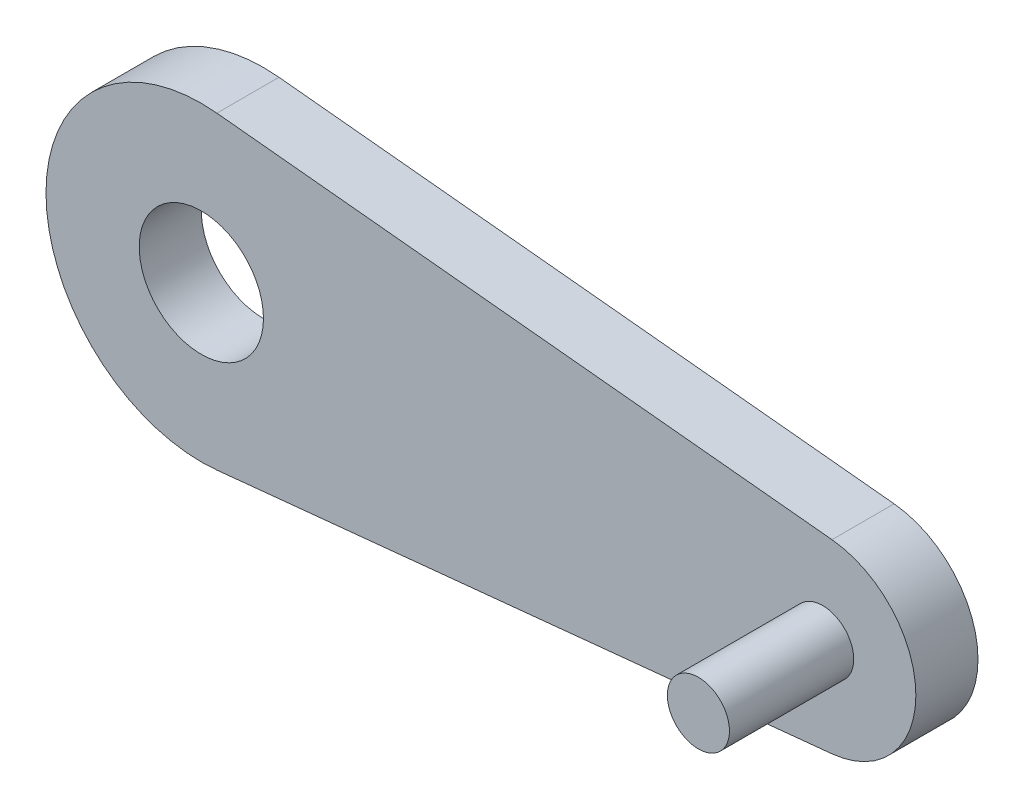
ISO-10303-21;
HEADER;
FILE_DESCRIPTION(('STEP AP214'),'2;1');
FILE_NAME('part.step','',(''),(''),'','','');
FILE_SCHEMA(('AUTOMOTIVE_DESIGN { 1 0 10303 214 1 1 1 1 }'));
ENDSEC;
DATA;
#1=APPLICATION_CONTEXT('core data for automotive mechanical design processes');
#2=APPLICATION_PROTOCOL_DEFINITION('international standard','automotive_design',2000,#1);
#3=PRODUCT_CONTEXT('',#1,'mechanical');
#4=PRODUCT('Part','Part','',(#3));
#5=PRODUCT_RELATED_PRODUCT_CATEGORY('part','',(#4));
#6=PRODUCT_DEFINITION_FORMATION('','',#4);
#7=PRODUCT_DEFINITION_CONTEXT('part definition',#1,'design');
#8=PRODUCT_DEFINITION('design','',#6,#7);
#9=PRODUCT_DEFINITION_SHAPE('','',#8);
#10=(LENGTH_UNIT() NAMED_UNIT(*) SI_UNIT(.MILLI.,.METRE.));
#11=(NAMED_UNIT(*) PLANE_ANGLE_UNIT() SI_UNIT($,.RADIAN.));
#12=(NAMED_UNIT(*) SI_UNIT($,.STERADIAN.) SOLID_ANGLE_UNIT());
#13=UNCERTAINTY_MEASURE_WITH_UNIT(LENGTH_MEASURE(1.E-05),#10,'distance_accuracy_value','');
#14=(GEOMETRIC_REPRESENTATION_CONTEXT(3) GLOBAL_UNCERTAINTY_ASSIGNED_CONTEXT((#13)) GLOBAL_UNIT_ASSIGNED_CONTEXT((#10,
#11,#12)) REPRESENTATION_CONTEXT('',''));
#15=CARTESIAN_POINT('',(0.,0.,0.));
#16=DIRECTION('',(0.,0.,1.));
#17=DIRECTION('',(1.,0.,0.));
#18=AXIS2_PLACEMENT_3D('',#15,#16,#17);
#19=CARTESIAN_POINT('',(0.,0.,1.));
#20=DIRECTION('',(0.,0.,1.));
#21=DIRECTION('',(1.,0.,0.));
#22=AXIS2_PLACEMENT_3D('',#19,#20,#21);
#23=PLANE('',#22);
#24=CARTESIAN_POINT('',(10.,0.,1.));
#25=DIRECTION('',(0.,0.,1.));
#26=DIRECTION('',(1.,0.,0.));
#27=AXIS2_PLACEMENT_3D('',#24,#25,#26);
#28=CIRCLE('',#27,0.500000000000001);
#29=CARTESIAN_POINT('',(10.5,0.,1.));
#30=VERTEX_POINT('',#29);
#31=EDGE_CURVE('E117',#30,#30,#28,.T.);
#32=ORIENTED_EDGE('',*,*,#31,.F.);
#33=EDGE_LOOP('',(#32));
#34=FACE_BOUND('',#33,.T.);
#35=CARTESIAN_POINT('',(0.,0.,1.));
#36=DIRECTION('',(0.,0.,1.));
#37=DIRECTION('',(1.,0.,0.));
#38=AXIS2_PLACEMENT_3D('',#35,#36,#37);
#39=CIRCLE('',#38,2.5);
#40=CARTESIAN_POINT('',(0.25,2.48746859276655,1.));
#41=VERTEX_POINT('',#40);
#42=CARTESIAN_POINT('',(0.25,-2.48746859276655,1.));
#43=VERTEX_POINT('',#42);
#44=EDGE_CURVE('E84',#41,#43,#39,.T.);
#45=ORIENTED_EDGE('',*,*,#44,.T.);
#46=DIRECTION('',(0.99498743710662,0.1,0.));
#47=VECTOR('',#46,1.);
#48=CARTESIAN_POINT('',(0.25,-2.48746859276655,1.));
#49=LINE('',#48,#47);
#50=CARTESIAN_POINT('',(10.15,-1.49248115565993,1.));
#51=VERTEX_POINT('',#50);
#52=EDGE_CURVE('E79',#43,#51,#49,.T.);
#53=ORIENTED_EDGE('',*,*,#52,.T.);
#54=CARTESIAN_POINT('',(10.,0.,1.));
#55=DIRECTION('',(0.,0.,1.));
#56=DIRECTION('',(1.,0.,0.));
#57=AXIS2_PLACEMENT_3D('',#54,#55,#56);
#58=CIRCLE('',#57,1.5);
#59=CARTESIAN_POINT('',(10.15,1.49248115565993,1.));
#60=VERTEX_POINT('',#59);
#61=EDGE_CURVE('E82',#51,#60,#58,.T.);
#62=ORIENTED_EDGE('',*,*,#61,.T.);
#63=DIRECTION('',(-0.99498743710662,0.1,0.));
#64=VECTOR('',#63,1.);
#65=CARTESIAN_POINT('',(0.25,2.48746859276655,1.));
#66=LINE('',#65,#64);
#67=EDGE_CURVE('E49',#60,#41,#66,.T.);
#68=ORIENTED_EDGE('',*,*,#67,.T.);
#69=EDGE_LOOP('',(#45,#53,#62,#68));
#70=FACE_BOUND('',#69,.T.);
#71=CARTESIAN_POINT('',(0.,0.,1.));
#72=DIRECTION('',(0.,0.,1.));
#73=DIRECTION('',(1.,0.,0.));
#74=AXIS2_PLACEMENT_3D('',#71,#72,#73);
#75=CIRCLE('',#74,1.);
#76=CARTESIAN_POINT('',(1.,0.,1.));
#77=VERTEX_POINT('',#76);
#78=EDGE_CURVE('E99',#77,#77,#75,.T.);
#79=ORIENTED_EDGE('',*,*,#78,.F.);
#80=EDGE_LOOP('',(#79));
#81=FACE_BOUND('',#80,.T.);
#82=ADVANCED_FACE('F32',(#34,#70,#81),#23,.T.);
#83=CARTESIAN_POINT('',(0.,0.,0.));
#84=DIRECTION('',(0.,0.,1.));
#85=DIRECTION('',(1.,0.,0.));
#86=AXIS2_PLACEMENT_3D('',#83,#84,#85);
#87=PLANE('',#86);
#88=CARTESIAN_POINT('',(0.,0.,0.));
#89=DIRECTION('',(0.,0.,1.));
#90=DIRECTION('',(1.,0.,0.));
#91=AXIS2_PLACEMENT_3D('',#88,#89,#90);
#92=CIRCLE('',#91,2.5);
#93=CARTESIAN_POINT('',(0.25,2.48746859276655,0.));
#94=VERTEX_POINT('',#93);
#95=CARTESIAN_POINT('',(0.25,-2.48746859276655,0.));
#96=VERTEX_POINT('',#95);
#97=EDGE_CURVE('E96',#94,#96,#92,.T.);
#98=ORIENTED_EDGE('',*,*,#97,.F.);
#99=DIRECTION('',(-0.99498743710662,0.1,0.));
#100=VECTOR('',#99,1.);
#101=CARTESIAN_POINT('',(0.25,2.48746859276655,0.));
#102=LINE('',#101,#100);
#103=CARTESIAN_POINT('',(10.15,1.49248115565993,0.));
#104=VERTEX_POINT('',#103);
#105=EDGE_CURVE('E72',#104,#94,#102,.T.);
#106=ORIENTED_EDGE('',*,*,#105,.F.);
#107=CARTESIAN_POINT('',(10.,0.,0.));
#108=DIRECTION('',(0.,0.,1.));
#109=DIRECTION('',(1.,0.,0.));
#110=AXIS2_PLACEMENT_3D('',#107,#108,#109);
#111=CIRCLE('',#110,1.5);
#112=CARTESIAN_POINT('',(10.15,-1.49248115565993,0.));
#113=VERTEX_POINT('',#112);
#114=EDGE_CURVE('E66',#113,#104,#111,.T.);
#115=ORIENTED_EDGE('',*,*,#114,.F.);
#116=DIRECTION('',(0.99498743710662,0.1,0.));
#117=VECTOR('',#116,1.);
#118=CARTESIAN_POINT('',(0.25,-2.48746859276655,0.));
#119=LINE('',#118,#117);
#120=EDGE_CURVE('E88',#96,#113,#119,.T.);
#121=ORIENTED_EDGE('',*,*,#120,.F.);
#122=EDGE_LOOP('',(#98,#106,#115,#121));
#123=FACE_BOUND('',#122,.T.);
#124=CARTESIAN_POINT('',(0.,0.,0.));
#125=DIRECTION('',(0.,0.,1.));
#126=DIRECTION('',(1.,0.,0.));
#127=AXIS2_PLACEMENT_3D('',#124,#125,#126);
#128=CIRCLE('',#127,1.);
#129=CARTESIAN_POINT('',(1.,0.,0.));
#130=VERTEX_POINT('',#129);
#131=EDGE_CURVE('E111',#130,#130,#128,.T.);
#132=ORIENTED_EDGE('',*,*,#131,.T.);
#133=EDGE_LOOP('',(#132));
#134=FACE_BOUND('',#133,.T.);
#135=ADVANCED_FACE('F107',(#123,#134),#87,.F.);
#136=CARTESIAN_POINT('',(0.,0.,1.));
#137=DIRECTION('',(0.,0.,-1.));
#138=DIRECTION('',(-1.,0.,0.));
#139=AXIS2_PLACEMENT_3D('',#136,#137,#138);
#140=CYLINDRICAL_SURFACE('',#139,2.5);
#141=ORIENTED_EDGE('',*,*,#97,.T.);
#142=DIRECTION('',(0.,0.,-1.));
#143=VECTOR('',#142,1.);
#144=CARTESIAN_POINT('',(0.25,-2.48746859276655,1.));
#145=LINE('',#144,#143);
#146=EDGE_CURVE('E11',#43,#96,#145,.T.);
#147=ORIENTED_EDGE('',*,*,#146,.F.);
#148=ORIENTED_EDGE('',*,*,#44,.F.);
#149=DIRECTION('',(0.,0.,-1.));
#150=VECTOR('',#149,1.);
#151=CARTESIAN_POINT('',(0.25,2.48746859276655,1.));
#152=LINE('',#151,#150);
#153=EDGE_CURVE('E92',#41,#94,#152,.T.);
#154=ORIENTED_EDGE('',*,*,#153,.T.);
#155=EDGE_LOOP('',(#141,#147,#148,#154));
#156=FACE_BOUND('',#155,.T.);
#157=ADVANCED_FACE('F34',(#156),#140,.T.);
#158=CARTESIAN_POINT('',(0.25,-2.48746859276655,1.));
#159=DIRECTION('',(-0.1,0.99498743710662,0.));
#160=DIRECTION('',(-0.99498743710662,-0.1,0.));
#161=AXIS2_PLACEMENT_3D('',#158,#159,#160);
#162=PLANE('',#161);
#163=ORIENTED_EDGE('',*,*,#120,.T.);
#164=DIRECTION('',(0.,0.,-1.));
#165=VECTOR('',#164,1.);
#166=CARTESIAN_POINT('',(10.15,-1.49248115565993,1.));
#167=LINE('',#166,#165);
#168=EDGE_CURVE('E41',#51,#113,#167,.T.);
#169=ORIENTED_EDGE('',*,*,#168,.F.);
#170=ORIENTED_EDGE('',*,*,#52,.F.);
#171=ORIENTED_EDGE('',*,*,#146,.T.);
#172=EDGE_LOOP('',(#163,#169,#170,#171));
#173=FACE_BOUND('',#172,.T.);
#174=ADVANCED_FACE('F87',(#173),#162,.F.);
#175=CARTESIAN_POINT('',(10.,0.,1.));
#176=DIRECTION('',(0.,0.,-1.));
#177=DIRECTION('',(-1.,0.,0.));
#178=AXIS2_PLACEMENT_3D('',#175,#176,#177);
#179=CYLINDRICAL_SURFACE('',#178,1.5);
#180=ORIENTED_EDGE('',*,*,#114,.T.);
#181=DIRECTION('',(0.,0.,-1.));
#182=VECTOR('',#181,1.);
#183=CARTESIAN_POINT('',(10.15,1.49248115565993,1.));
#184=LINE('',#183,#182);
#185=EDGE_CURVE('E89',#60,#104,#184,.T.);
#186=ORIENTED_EDGE('',*,*,#185,.F.);
#187=ORIENTED_EDGE('',*,*,#61,.F.);
#188=ORIENTED_EDGE('',*,*,#168,.T.);
#189=EDGE_LOOP('',(#180,#186,#187,#188));
#190=FACE_BOUND('',#189,.T.);
#191=ADVANCED_FACE('F90',(#190),#179,.T.);
#192=CARTESIAN_POINT('',(0.25,2.48746859276655,1.));
#193=DIRECTION('',(-0.1,-0.99498743710662,0.));
#194=DIRECTION('',(0.99498743710662,-0.1,0.));
#195=AXIS2_PLACEMENT_3D('',#192,#193,#194);
#196=PLANE('',#195);
#197=ORIENTED_EDGE('',*,*,#105,.T.);
#198=ORIENTED_EDGE('',*,*,#153,.F.);
#199=ORIENTED_EDGE('',*,*,#67,.F.);
#200=ORIENTED_EDGE('',*,*,#185,.T.);
#201=EDGE_LOOP('',(#197,#198,#199,#200));
#202=FACE_BOUND('',#201,.T.);
#203=ADVANCED_FACE('F104',(#202),#196,.F.);
#204=CARTESIAN_POINT('',(0.,0.,1.));
#205=DIRECTION('',(0.,0.,-1.));
#206=DIRECTION('',(-1.,0.,0.));
#207=AXIS2_PLACEMENT_3D('',#204,#205,#206);
#208=CYLINDRICAL_SURFACE('',#207,1.);
#209=ORIENTED_EDGE('',*,*,#78,.T.);
#210=EDGE_LOOP('',(#209));
#211=FACE_BOUND('',#210,.T.);
#212=ORIENTED_EDGE('',*,*,#131,.F.);
#213=EDGE_LOOP('',(#212));
#214=FACE_BOUND('',#213,.T.);
#215=ADVANCED_FACE('F128',(#211,#214),#208,.F.);
#216=CARTESIAN_POINT('',(10.,0.,3.));
#217=DIRECTION('',(0.,0.,-1.));
#218=DIRECTION('',(-1.,0.,0.));
#219=AXIS2_PLACEMENT_3D('',#216,#217,#218);
#220=CYLINDRICAL_SURFACE('',#219,0.500000000000001);
#221=CARTESIAN_POINT('',(10.,0.,3.));
#222=DIRECTION('',(0.,0.,1.));
#223=DIRECTION('',(1.,0.,0.));
#224=AXIS2_PLACEMENT_3D('',#221,#222,#223);
#225=CIRCLE('',#224,0.500000000000001);
#226=CARTESIAN_POINT('',(10.5,0.,3.));
#227=VERTEX_POINT('',#226);
#228=EDGE_CURVE('E114',#227,#227,#225,.T.);
#229=ORIENTED_EDGE('',*,*,#228,.F.);
#230=EDGE_LOOP('',(#229));
#231=FACE_BOUND('',#230,.T.);
#232=ORIENTED_EDGE('',*,*,#31,.T.);
#233=EDGE_LOOP('',(#232));
#234=FACE_BOUND('',#233,.T.);
#235=ADVANCED_FACE('F125',(#231,#234),#220,.T.);
#236=CARTESIAN_POINT('',(10.,0.,3.));
#237=DIRECTION('',(0.,0.,1.));
#238=DIRECTION('',(1.,0.,0.));
#239=AXIS2_PLACEMENT_3D('',#236,#237,#238);
#240=PLANE('',#239);
#241=ORIENTED_EDGE('',*,*,#228,.T.);
#242=EDGE_LOOP('',(#241));
#243=FACE_BOUND('',#242,.T.);
#244=ADVANCED_FACE('F123',(#243),#240,.T.);
#245=CLOSED_SHELL('',(#82,#135,#157,#174,#191,#203,#215,#235,#244));
#246=MANIFOLD_SOLID_BREP('B2',#245);
#247=ADVANCED_BREP_SHAPE_REPRESENTATION('',(#18,#246),#14);
#248=SHAPE_DEFINITION_REPRESENTATION(#9,#247);
ENDSEC;
END-ISO-10303-21;
